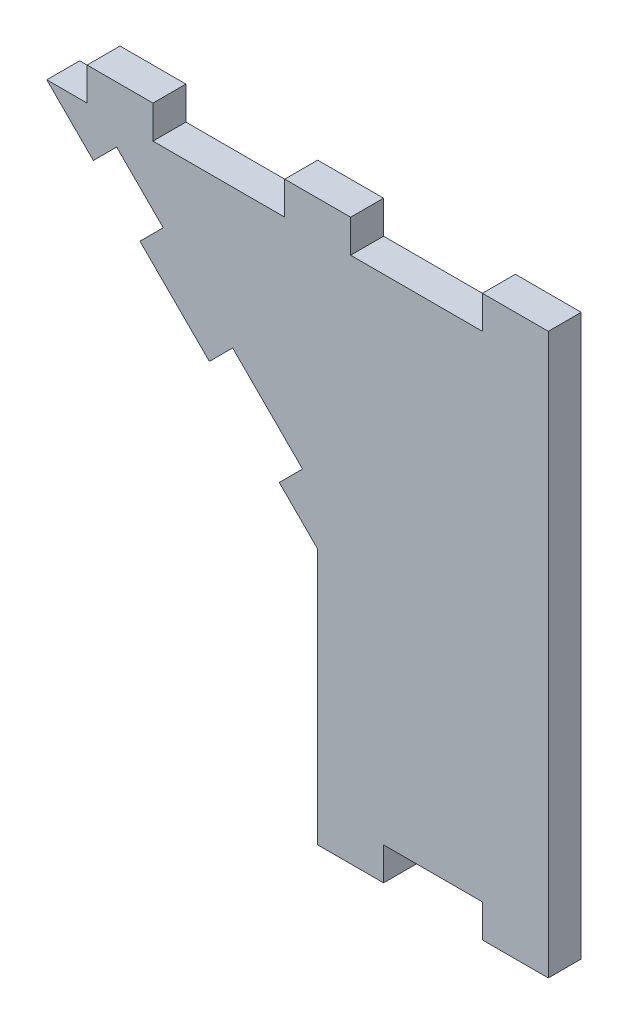
ISO-10303-21;
HEADER;
FILE_DESCRIPTION(('STEP AP214'),'2;1');
FILE_NAME('part.step','',(''),(''),'','','');
FILE_SCHEMA(('AUTOMOTIVE_DESIGN { 1 0 10303 214 1 1 1 1 }'));
ENDSEC;
DATA;
#1=APPLICATION_CONTEXT('core data for automotive mechanical design processes');
#2=APPLICATION_PROTOCOL_DEFINITION('international standard','automotive_design',2000,#1);
#3=PRODUCT_CONTEXT('',#1,'mechanical');
#4=PRODUCT('Part','Part','',(#3));
#5=PRODUCT_RELATED_PRODUCT_CATEGORY('part','',(#4));
#6=PRODUCT_DEFINITION_FORMATION('','',#4);
#7=PRODUCT_DEFINITION_CONTEXT('part definition',#1,'design');
#8=PRODUCT_DEFINITION('design','',#6,#7);
#9=PRODUCT_DEFINITION_SHAPE('','',#8);
#10=(LENGTH_UNIT() NAMED_UNIT(*) SI_UNIT(.MILLI.,.METRE.));
#11=(NAMED_UNIT(*) PLANE_ANGLE_UNIT() SI_UNIT($,.RADIAN.));
#12=(NAMED_UNIT(*) SI_UNIT($,.STERADIAN.) SOLID_ANGLE_UNIT());
#13=UNCERTAINTY_MEASURE_WITH_UNIT(LENGTH_MEASURE(1.E-05),#10,'distance_accuracy_value','');
#14=(GEOMETRIC_REPRESENTATION_CONTEXT(3) GLOBAL_UNCERTAINTY_ASSIGNED_CONTEXT((#13)) GLOBAL_UNIT_ASSIGNED_CONTEXT((#10,
#11,#12)) REPRESENTATION_CONTEXT('',''));
#15=CARTESIAN_POINT('',(0.,0.,0.));
#16=DIRECTION('',(0.,0.,1.));
#17=DIRECTION('',(1.,0.,0.));
#18=AXIS2_PLACEMENT_3D('',#15,#16,#17);
#19=CARTESIAN_POINT('',(0.,75.,5.));
#20=DIRECTION('',(-1.,0.,0.));
#21=DIRECTION('',(0.,0.,1.));
#22=AXIS2_PLACEMENT_3D('',#19,#20,#21);
#23=PLANE('',#22);
#24=DIRECTION('',(0.,1.,0.));
#25=VECTOR('',#24,1.);
#26=CARTESIAN_POINT('',(0.,75.,0.));
#27=LINE('',#26,#25);
#28=CARTESIAN_POINT('',(0.,-5.,0.));
#29=VERTEX_POINT('',#28);
#30=CARTESIAN_POINT('',(0.,80.,0.));
#31=VERTEX_POINT('',#30);
#32=EDGE_CURVE('E142',#29,#31,#27,.T.);
#33=ORIENTED_EDGE('',*,*,#32,.T.);
#34=DIRECTION('',(0.,0.,-1.));
#35=VECTOR('',#34,1.);
#36=CARTESIAN_POINT('',(0.,80.,5.));
#37=LINE('',#36,#35);
#38=CARTESIAN_POINT('',(0.,80.,5.));
#39=VERTEX_POINT('',#38);
#40=EDGE_CURVE('E11',#39,#31,#37,.T.);
#41=ORIENTED_EDGE('',*,*,#40,.F.);
#42=DIRECTION('',(0.,1.,0.));
#43=VECTOR('',#42,1.);
#44=CARTESIAN_POINT('',(0.,0.,5.));
#45=LINE('',#44,#43);
#46=CARTESIAN_POINT('',(0.,-5.,5.));
#47=VERTEX_POINT('',#46);
#48=EDGE_CURVE('E148',#47,#39,#45,.T.);
#49=ORIENTED_EDGE('',*,*,#48,.F.);
#50=DIRECTION('',(0.,0.,-1.));
#51=VECTOR('',#50,1.);
#52=CARTESIAN_POINT('',(0.,-5.,5.));
#53=LINE('',#52,#51);
#54=EDGE_CURVE('E239',#47,#29,#53,.T.);
#55=ORIENTED_EDGE('',*,*,#54,.T.);
#56=EDGE_LOOP('',(#33,#41,#49,#55));
#57=FACE_BOUND('',#56,.T.);
#58=ADVANCED_FACE('F33',(#57),#23,.F.);
#59=CARTESIAN_POINT('',(0.,80.,5.));
#60=DIRECTION('',(0.,-1.,0.));
#61=DIRECTION('',(0.,0.,-1.));
#62=AXIS2_PLACEMENT_3D('',#59,#60,#61);
#63=PLANE('',#62);
#64=DIRECTION('',(-1.,0.,0.));
#65=VECTOR('',#64,1.);
#66=CARTESIAN_POINT('',(0.,80.,0.));
#67=LINE('',#66,#65);
#68=CARTESIAN_POINT('',(-10.,80.,0.));
#69=VERTEX_POINT('',#68);
#70=EDGE_CURVE('E244',#31,#69,#67,.T.);
#71=ORIENTED_EDGE('',*,*,#70,.T.);
#72=DIRECTION('',(0.,0.,-1.));
#73=VECTOR('',#72,1.);
#74=CARTESIAN_POINT('',(-10.,80.,5.));
#75=LINE('',#74,#73);
#76=CARTESIAN_POINT('',(-10.,80.,5.));
#77=VERTEX_POINT('',#76);
#78=EDGE_CURVE('E41',#77,#69,#75,.T.);
#79=ORIENTED_EDGE('',*,*,#78,.F.);
#80=DIRECTION('',(-1.,0.,0.));
#81=VECTOR('',#80,1.);
#82=CARTESIAN_POINT('',(0.,80.,5.));
#83=LINE('',#82,#81);
#84=EDGE_CURVE('E438',#39,#77,#83,.T.);
#85=ORIENTED_EDGE('',*,*,#84,.F.);
#86=ORIENTED_EDGE('',*,*,#40,.T.);
#87=EDGE_LOOP('',(#71,#79,#85,#86));
#88=FACE_BOUND('',#87,.T.);
#89=ADVANCED_FACE('F441',(#88),#63,.F.);
#90=CARTESIAN_POINT('',(-10.,75.,5.));
#91=DIRECTION('',(1.,0.,0.));
#92=DIRECTION('',(0.,0.,-1.));
#93=AXIS2_PLACEMENT_3D('',#90,#91,#92);
#94=PLANE('',#93);
#95=DIRECTION('',(0.,-1.,0.));
#96=VECTOR('',#95,1.);
#97=CARTESIAN_POINT('',(-10.,75.,0.));
#98=LINE('',#97,#96);
#99=CARTESIAN_POINT('',(-10.,75.,0.));
#100=VERTEX_POINT('',#99);
#101=EDGE_CURVE('E246',#69,#100,#98,.T.);
#102=ORIENTED_EDGE('',*,*,#101,.T.);
#103=DIRECTION('',(0.,0.,-1.));
#104=VECTOR('',#103,1.);
#105=CARTESIAN_POINT('',(-10.,75.,5.));
#106=LINE('',#105,#104);
#107=CARTESIAN_POINT('',(-10.,75.,5.));
#108=VERTEX_POINT('',#107);
#109=EDGE_CURVE('E359',#108,#100,#106,.T.);
#110=ORIENTED_EDGE('',*,*,#109,.F.);
#111=DIRECTION('',(0.,-1.,0.));
#112=VECTOR('',#111,1.);
#113=CARTESIAN_POINT('',(-10.,75.,5.));
#114=LINE('',#113,#112);
#115=EDGE_CURVE('E368',#77,#108,#114,.T.);
#116=ORIENTED_EDGE('',*,*,#115,.F.);
#117=ORIENTED_EDGE('',*,*,#78,.T.);
#118=EDGE_LOOP('',(#102,#110,#116,#117));
#119=FACE_BOUND('',#118,.T.);
#120=ADVANCED_FACE('F366',(#119),#94,.F.);
#121=CARTESIAN_POINT('',(-30.,75.,5.));
#122=DIRECTION('',(0.,-1.,0.));
#123=DIRECTION('',(1.,0.,0.));
#124=AXIS2_PLACEMENT_3D('',#121,#122,#123);
#125=PLANE('',#124);
#126=DIRECTION('',(-1.,0.,0.));
#127=VECTOR('',#126,1.);
#128=CARTESIAN_POINT('',(-30.,75.,0.));
#129=LINE('',#128,#127);
#130=CARTESIAN_POINT('',(-30.,75.,0.));
#131=VERTEX_POINT('',#130);
#132=EDGE_CURVE('E248',#100,#131,#129,.T.);
#133=ORIENTED_EDGE('',*,*,#132,.T.);
#134=DIRECTION('',(0.,0.,-1.));
#135=VECTOR('',#134,1.);
#136=CARTESIAN_POINT('',(-30.,75.,5.));
#137=LINE('',#136,#135);
#138=CARTESIAN_POINT('',(-30.,75.,5.));
#139=VERTEX_POINT('',#138);
#140=EDGE_CURVE('E356',#139,#131,#137,.T.);
#141=ORIENTED_EDGE('',*,*,#140,.F.);
#142=DIRECTION('',(-1.,0.,0.));
#143=VECTOR('',#142,1.);
#144=CARTESIAN_POINT('',(-30.,75.,5.));
#145=LINE('',#144,#143);
#146=EDGE_CURVE('E386',#108,#139,#145,.T.);
#147=ORIENTED_EDGE('',*,*,#146,.F.);
#148=ORIENTED_EDGE('',*,*,#109,.T.);
#149=EDGE_LOOP('',(#133,#141,#147,#148));
#150=FACE_BOUND('',#149,.T.);
#151=ADVANCED_FACE('F377',(#150),#125,.F.);
#152=CARTESIAN_POINT('',(-30.,75.,5.));
#153=DIRECTION('',(-1.,0.,0.));
#154=DIRECTION('',(0.,0.,1.));
#155=AXIS2_PLACEMENT_3D('',#152,#153,#154);
#156=PLANE('',#155);
#157=DIRECTION('',(0.,1.,0.));
#158=VECTOR('',#157,1.);
#159=CARTESIAN_POINT('',(-30.,75.,0.));
#160=LINE('',#159,#158);
#161=CARTESIAN_POINT('',(-30.,80.,0.));
#162=VERTEX_POINT('',#161);
#163=EDGE_CURVE('E250',#131,#162,#160,.T.);
#164=ORIENTED_EDGE('',*,*,#163,.T.);
#165=DIRECTION('',(0.,0.,-1.));
#166=VECTOR('',#165,1.);
#167=CARTESIAN_POINT('',(-30.,80.,5.));
#168=LINE('',#167,#166);
#169=CARTESIAN_POINT('',(-30.,80.,5.));
#170=VERTEX_POINT('',#169);
#171=EDGE_CURVE('E353',#170,#162,#168,.T.);
#172=ORIENTED_EDGE('',*,*,#171,.F.);
#173=DIRECTION('',(0.,1.,0.));
#174=VECTOR('',#173,1.);
#175=CARTESIAN_POINT('',(-30.,75.,5.));
#176=LINE('',#175,#174);
#177=EDGE_CURVE('E383',#139,#170,#176,.T.);
#178=ORIENTED_EDGE('',*,*,#177,.F.);
#179=ORIENTED_EDGE('',*,*,#140,.T.);
#180=EDGE_LOOP('',(#164,#172,#178,#179));
#181=FACE_BOUND('',#180,.T.);
#182=ADVANCED_FACE('F381',(#181),#156,.F.);
#183=CARTESIAN_POINT('',(-40.,80.,5.));
#184=DIRECTION('',(0.,-1.,0.));
#185=DIRECTION('',(1.,0.,0.));
#186=AXIS2_PLACEMENT_3D('',#183,#184,#185);
#187=PLANE('',#186);
#188=DIRECTION('',(-1.,0.,0.));
#189=VECTOR('',#188,1.);
#190=CARTESIAN_POINT('',(-40.,80.,0.));
#191=LINE('',#190,#189);
#192=CARTESIAN_POINT('',(-40.,80.,0.));
#193=VERTEX_POINT('',#192);
#194=EDGE_CURVE('E252',#162,#193,#191,.T.);
#195=ORIENTED_EDGE('',*,*,#194,.T.);
#196=DIRECTION('',(0.,0.,-1.));
#197=VECTOR('',#196,1.);
#198=CARTESIAN_POINT('',(-40.,80.,5.));
#199=LINE('',#198,#197);
#200=CARTESIAN_POINT('',(-40.,80.,5.));
#201=VERTEX_POINT('',#200);
#202=EDGE_CURVE('E350',#201,#193,#199,.T.);
#203=ORIENTED_EDGE('',*,*,#202,.F.);
#204=DIRECTION('',(-1.,0.,0.));
#205=VECTOR('',#204,1.);
#206=CARTESIAN_POINT('',(-40.,80.,5.));
#207=LINE('',#206,#205);
#208=EDGE_CURVE('E385',#170,#201,#207,.T.);
#209=ORIENTED_EDGE('',*,*,#208,.F.);
#210=ORIENTED_EDGE('',*,*,#171,.T.);
#211=EDGE_LOOP('',(#195,#203,#209,#210));
#212=FACE_BOUND('',#211,.T.);
#213=ADVANCED_FACE('F453',(#212),#187,.F.);
#214=CARTESIAN_POINT('',(-40.,75.,5.));
#215=DIRECTION('',(1.,0.,0.));
#216=DIRECTION('',(0.,0.,-1.));
#217=AXIS2_PLACEMENT_3D('',#214,#215,#216);
#218=PLANE('',#217);
#219=DIRECTION('',(0.,-1.,0.));
#220=VECTOR('',#219,1.);
#221=CARTESIAN_POINT('',(-40.,75.,0.));
#222=LINE('',#221,#220);
#223=CARTESIAN_POINT('',(-40.,75.,0.));
#224=VERTEX_POINT('',#223);
#225=EDGE_CURVE('E254',#193,#224,#222,.T.);
#226=ORIENTED_EDGE('',*,*,#225,.T.);
#227=DIRECTION('',(0.,0.,-1.));
#228=VECTOR('',#227,1.);
#229=CARTESIAN_POINT('',(-40.,75.,5.));
#230=LINE('',#229,#228);
#231=CARTESIAN_POINT('',(-40.,75.,5.));
#232=VERTEX_POINT('',#231);
#233=EDGE_CURVE('E347',#232,#224,#230,.T.);
#234=ORIENTED_EDGE('',*,*,#233,.F.);
#235=DIRECTION('',(0.,-1.,0.));
#236=VECTOR('',#235,1.);
#237=CARTESIAN_POINT('',(-40.,75.,5.));
#238=LINE('',#237,#236);
#239=EDGE_CURVE('E388',#201,#232,#238,.T.);
#240=ORIENTED_EDGE('',*,*,#239,.F.);
#241=ORIENTED_EDGE('',*,*,#202,.T.);
#242=EDGE_LOOP('',(#226,#234,#240,#241));
#243=FACE_BOUND('',#242,.T.);
#244=ADVANCED_FACE('F456',(#243),#218,.F.);
#245=CARTESIAN_POINT('',(-60.,75.,5.));
#246=DIRECTION('',(0.,-1.,0.));
#247=DIRECTION('',(0.,0.,-1.));
#248=AXIS2_PLACEMENT_3D('',#245,#246,#247);
#249=PLANE('',#248);
#250=DIRECTION('',(-1.,0.,0.));
#251=VECTOR('',#250,1.);
#252=CARTESIAN_POINT('',(-60.,75.,0.));
#253=LINE('',#252,#251);
#254=CARTESIAN_POINT('',(-60.,75.,0.));
#255=VERTEX_POINT('',#254);
#256=EDGE_CURVE('E256',#224,#255,#253,.T.);
#257=ORIENTED_EDGE('',*,*,#256,.T.);
#258=DIRECTION('',(0.,0.,-1.));
#259=VECTOR('',#258,1.);
#260=CARTESIAN_POINT('',(-60.,75.,5.));
#261=LINE('',#260,#259);
#262=CARTESIAN_POINT('',(-60.,75.,5.));
#263=VERTEX_POINT('',#262);
#264=EDGE_CURVE('E344',#263,#255,#261,.T.);
#265=ORIENTED_EDGE('',*,*,#264,.F.);
#266=DIRECTION('',(-1.,0.,0.));
#267=VECTOR('',#266,1.);
#268=CARTESIAN_POINT('',(-60.,75.,5.));
#269=LINE('',#268,#267);
#270=EDGE_CURVE('E394',#232,#263,#269,.T.);
#271=ORIENTED_EDGE('',*,*,#270,.F.);
#272=ORIENTED_EDGE('',*,*,#233,.T.);
#273=EDGE_LOOP('',(#257,#265,#271,#272));
#274=FACE_BOUND('',#273,.T.);
#275=ADVANCED_FACE('F460',(#274),#249,.F.);
#276=CARTESIAN_POINT('',(-60.,75.,5.));
#277=DIRECTION('',(-1.,0.,0.));
#278=DIRECTION('',(0.,0.,1.));
#279=AXIS2_PLACEMENT_3D('',#276,#277,#278);
#280=PLANE('',#279);
#281=DIRECTION('',(0.,1.,0.));
#282=VECTOR('',#281,1.);
#283=CARTESIAN_POINT('',(-60.,75.,0.));
#284=LINE('',#283,#282);
#285=CARTESIAN_POINT('',(-60.,80.,0.));
#286=VERTEX_POINT('',#285);
#287=EDGE_CURVE('E258',#255,#286,#284,.T.);
#288=ORIENTED_EDGE('',*,*,#287,.T.);
#289=DIRECTION('',(0.,0.,-1.));
#290=VECTOR('',#289,1.);
#291=CARTESIAN_POINT('',(-60.,80.,5.));
#292=LINE('',#291,#290);
#293=CARTESIAN_POINT('',(-60.,80.,5.));
#294=VERTEX_POINT('',#293);
#295=EDGE_CURVE('E341',#294,#286,#292,.T.);
#296=ORIENTED_EDGE('',*,*,#295,.F.);
#297=DIRECTION('',(0.,1.,0.));
#298=VECTOR('',#297,1.);
#299=CARTESIAN_POINT('',(-60.,75.,5.));
#300=LINE('',#299,#298);
#301=EDGE_CURVE('E396',#263,#294,#300,.T.);
#302=ORIENTED_EDGE('',*,*,#301,.F.);
#303=ORIENTED_EDGE('',*,*,#264,.T.);
#304=EDGE_LOOP('',(#288,#296,#302,#303));
#305=FACE_BOUND('',#304,.T.);
#306=ADVANCED_FACE('F464',(#305),#280,.F.);
#307=CARTESIAN_POINT('',(-70.,80.,5.));
#308=DIRECTION('',(0.,-1.,0.));
#309=DIRECTION('',(1.,0.,0.));
#310=AXIS2_PLACEMENT_3D('',#307,#308,#309);
#311=PLANE('',#310);
#312=DIRECTION('',(-1.,0.,0.));
#313=VECTOR('',#312,1.);
#314=CARTESIAN_POINT('',(-70.,80.,0.));
#315=LINE('',#314,#313);
#316=CARTESIAN_POINT('',(-70.,80.,0.));
#317=VERTEX_POINT('',#316);
#318=EDGE_CURVE('E260',#286,#317,#315,.T.);
#319=ORIENTED_EDGE('',*,*,#318,.T.);
#320=DIRECTION('',(0.,0.,-1.));
#321=VECTOR('',#320,1.);
#322=CARTESIAN_POINT('',(-70.,80.,5.));
#323=LINE('',#322,#321);
#324=CARTESIAN_POINT('',(-70.,80.,5.));
#325=VERTEX_POINT('',#324);
#326=EDGE_CURVE('E338',#325,#317,#323,.T.);
#327=ORIENTED_EDGE('',*,*,#326,.F.);
#328=DIRECTION('',(-1.,0.,0.));
#329=VECTOR('',#328,1.);
#330=CARTESIAN_POINT('',(-70.,80.,5.));
#331=LINE('',#330,#329);
#332=EDGE_CURVE('E398',#294,#325,#331,.T.);
#333=ORIENTED_EDGE('',*,*,#332,.F.);
#334=ORIENTED_EDGE('',*,*,#295,.T.);
#335=EDGE_LOOP('',(#319,#327,#333,#334));
#336=FACE_BOUND('',#335,.T.);
#337=ADVANCED_FACE('F468',(#336),#311,.F.);
#338=CARTESIAN_POINT('',(-70.,75.,5.));
#339=DIRECTION('',(1.,0.,0.));
#340=DIRECTION('',(0.,0.,-1.));
#341=AXIS2_PLACEMENT_3D('',#338,#339,#340);
#342=PLANE('',#341);
#343=DIRECTION('',(0.,-1.,0.));
#344=VECTOR('',#343,1.);
#345=CARTESIAN_POINT('',(-70.,75.,0.));
#346=LINE('',#345,#344);
#347=CARTESIAN_POINT('',(-70.,75.,0.));
#348=VERTEX_POINT('',#347);
#349=EDGE_CURVE('E262',#317,#348,#346,.T.);
#350=ORIENTED_EDGE('',*,*,#349,.T.);
#351=DIRECTION('',(0.,0.,-1.));
#352=VECTOR('',#351,1.);
#353=CARTESIAN_POINT('',(-70.,75.,5.));
#354=LINE('',#353,#352);
#355=CARTESIAN_POINT('',(-70.,75.,5.));
#356=VERTEX_POINT('',#355);
#357=EDGE_CURVE('E335',#356,#348,#354,.T.);
#358=ORIENTED_EDGE('',*,*,#357,.F.);
#359=DIRECTION('',(0.,-1.,0.));
#360=VECTOR('',#359,1.);
#361=CARTESIAN_POINT('',(-70.,75.,5.));
#362=LINE('',#361,#360);
#363=EDGE_CURVE('E400',#325,#356,#362,.T.);
#364=ORIENTED_EDGE('',*,*,#363,.F.);
#365=ORIENTED_EDGE('',*,*,#326,.T.);
#366=EDGE_LOOP('',(#350,#358,#364,#365));
#367=FACE_BOUND('',#366,.T.);
#368=ADVANCED_FACE('F472',(#367),#342,.F.);
#369=CARTESIAN_POINT('',(-76.1182593259979,75.,5.));
#370=DIRECTION('',(0.,-1.,0.));
#371=DIRECTION('',(0.,0.,-1.));
#372=AXIS2_PLACEMENT_3D('',#369,#370,#371);
#373=PLANE('',#372);
#374=DIRECTION('',(-1.,0.,0.));
#375=VECTOR('',#374,1.);
#376=CARTESIAN_POINT('',(-76.1182593259979,75.,0.));
#377=LINE('',#376,#375);
#378=CARTESIAN_POINT('',(-76.1182593259979,75.,0.));
#379=VERTEX_POINT('',#378);
#380=EDGE_CURVE('E264',#348,#379,#377,.T.);
#381=ORIENTED_EDGE('',*,*,#380,.T.);
#382=DIRECTION('',(0.,0.,-1.));
#383=VECTOR('',#382,1.);
#384=CARTESIAN_POINT('',(-76.1182593259979,75.,5.));
#385=LINE('',#384,#383);
#386=CARTESIAN_POINT('',(-76.1182593259979,75.,5.));
#387=VERTEX_POINT('',#386);
#388=EDGE_CURVE('E332',#387,#379,#385,.T.);
#389=ORIENTED_EDGE('',*,*,#388,.F.);
#390=DIRECTION('',(-1.,0.,0.));
#391=VECTOR('',#390,1.);
#392=CARTESIAN_POINT('',(-76.1182593259979,75.,5.));
#393=LINE('',#392,#391);
#394=EDGE_CURVE('E402',#356,#387,#393,.T.);
#395=ORIENTED_EDGE('',*,*,#394,.F.);
#396=ORIENTED_EDGE('',*,*,#357,.T.);
#397=EDGE_LOOP('',(#381,#389,#395,#396));
#398=FACE_BOUND('',#397,.T.);
#399=ADVANCED_FACE('F476',(#398),#373,.F.);
#400=CARTESIAN_POINT('',(-69.0471915141324,67.9289321881346,5.));
#401=DIRECTION('',(0.707106781186544,0.707106781186551,0.));
#402=DIRECTION('',(-0.707106781186551,0.707106781186544,0.));
#403=AXIS2_PLACEMENT_3D('',#400,#401,#402);
#404=PLANE('',#403);
#405=DIRECTION('',(0.707106781186551,-0.707106781186544,0.));
#406=VECTOR('',#405,1.);
#407=CARTESIAN_POINT('',(-69.0471915141324,67.9289321881346,0.));
#408=LINE('',#407,#406);
#409=CARTESIAN_POINT('',(-69.0471915141324,67.9289321881346,0.));
#410=VERTEX_POINT('',#409);
#411=EDGE_CURVE('E266',#379,#410,#408,.T.);
#412=ORIENTED_EDGE('',*,*,#411,.T.);
#413=DIRECTION('',(0.,0.,-1.));
#414=VECTOR('',#413,1.);
#415=CARTESIAN_POINT('',(-69.0471915141324,67.9289321881346,5.));
#416=LINE('',#415,#414);
#417=CARTESIAN_POINT('',(-69.0471915141324,67.9289321881346,5.));
#418=VERTEX_POINT('',#417);
#419=EDGE_CURVE('E329',#418,#410,#416,.T.);
#420=ORIENTED_EDGE('',*,*,#419,.F.);
#421=DIRECTION('',(0.707106781186551,-0.707106781186544,0.));
#422=VECTOR('',#421,1.);
#423=CARTESIAN_POINT('',(-69.0471915141324,67.9289321881346,5.));
#424=LINE('',#423,#422);
#425=EDGE_CURVE('E404',#387,#418,#424,.T.);
#426=ORIENTED_EDGE('',*,*,#425,.F.);
#427=ORIENTED_EDGE('',*,*,#388,.T.);
#428=EDGE_LOOP('',(#412,#420,#426,#427));
#429=FACE_BOUND('',#428,.T.);
#430=ADVANCED_FACE('F480',(#429),#404,.F.);
#431=CARTESIAN_POINT('',(-69.0471915141324,67.9289321881346,5.));
#432=DIRECTION('',(-0.707106781186553,0.707106781186542,0.));
#433=DIRECTION('',(-0.707106781186542,-0.707106781186553,0.));
#434=AXIS2_PLACEMENT_3D('',#431,#432,#433);
#435=PLANE('',#434);
#436=DIRECTION('',(0.707106781186542,0.707106781186553,0.));
#437=VECTOR('',#436,1.);
#438=CARTESIAN_POINT('',(-69.0471915141324,67.9289321881346,0.));
#439=LINE('',#438,#437);
#440=CARTESIAN_POINT('',(-65.5116576081997,71.4644660940673,0.));
#441=VERTEX_POINT('',#440);
#442=EDGE_CURVE('E268',#410,#441,#439,.T.);
#443=ORIENTED_EDGE('',*,*,#442,.T.);
#444=DIRECTION('',(0.,0.,-1.));
#445=VECTOR('',#444,1.);
#446=CARTESIAN_POINT('',(-65.5116576081997,71.4644660940673,5.));
#447=LINE('',#446,#445);
#448=CARTESIAN_POINT('',(-65.5116576081997,71.4644660940673,5.));
#449=VERTEX_POINT('',#448);
#450=EDGE_CURVE('E326',#449,#441,#447,.T.);
#451=ORIENTED_EDGE('',*,*,#450,.F.);
#452=DIRECTION('',(0.707106781186542,0.707106781186553,0.));
#453=VECTOR('',#452,1.);
#454=CARTESIAN_POINT('',(-69.0471915141324,67.9289321881346,5.));
#455=LINE('',#454,#453);
#456=EDGE_CURVE('E406',#418,#449,#455,.T.);
#457=ORIENTED_EDGE('',*,*,#456,.F.);
#458=ORIENTED_EDGE('',*,*,#419,.T.);
#459=EDGE_LOOP('',(#443,#451,#457,#458));
#460=FACE_BOUND('',#459,.T.);
#461=ADVANCED_FACE('F484',(#460),#435,.F.);
#462=CARTESIAN_POINT('',(-65.5116576081997,71.4644660940673,5.));
#463=DIRECTION('',(0.707106781186544,0.707106781186551,0.));
#464=DIRECTION('',(-0.707106781186551,0.707106781186544,0.));
#465=AXIS2_PLACEMENT_3D('',#462,#463,#464);
#466=PLANE('',#465);
#467=DIRECTION('',(0.707106781186551,-0.707106781186544,0.));
#468=VECTOR('',#467,1.);
#469=CARTESIAN_POINT('',(-65.5116576081997,71.4644660940673,0.));
#470=LINE('',#469,#468);
#471=CARTESIAN_POINT('',(-58.4405897963342,64.3933982822019,0.));
#472=VERTEX_POINT('',#471);
#473=EDGE_CURVE('E270',#441,#472,#470,.T.);
#474=ORIENTED_EDGE('',*,*,#473,.T.);
#475=DIRECTION('',(0.,0.,-1.));
#476=VECTOR('',#475,1.);
#477=CARTESIAN_POINT('',(-58.4405897963342,64.3933982822019,5.));
#478=LINE('',#477,#476);
#479=CARTESIAN_POINT('',(-58.4405897963342,64.3933982822019,5.));
#480=VERTEX_POINT('',#479);
#481=EDGE_CURVE('E323',#480,#472,#478,.T.);
#482=ORIENTED_EDGE('',*,*,#481,.F.);
#483=DIRECTION('',(0.707106781186551,-0.707106781186544,0.));
#484=VECTOR('',#483,1.);
#485=CARTESIAN_POINT('',(-65.5116576081997,71.4644660940673,5.));
#486=LINE('',#485,#484);
#487=EDGE_CURVE('E408',#449,#480,#486,.T.);
#488=ORIENTED_EDGE('',*,*,#487,.F.);
#489=ORIENTED_EDGE('',*,*,#450,.T.);
#490=EDGE_LOOP('',(#474,#482,#488,#489));
#491=FACE_BOUND('',#490,.T.);
#492=ADVANCED_FACE('F488',(#491),#466,.F.);
#493=CARTESIAN_POINT('',(-61.9761237022669,60.8578643762691,5.));
#494=DIRECTION('',(0.707106781186551,-0.707106781186544,0.));
#495=DIRECTION('',(0.707106781186544,0.707106781186551,0.));
#496=AXIS2_PLACEMENT_3D('',#493,#494,#495);
#497=PLANE('',#496);
#498=DIRECTION('',(-0.707106781186544,-0.707106781186551,0.));
#499=VECTOR('',#498,1.);
#500=CARTESIAN_POINT('',(-61.9761237022669,60.8578643762691,0.));
#501=LINE('',#500,#499);
#502=CARTESIAN_POINT('',(-61.9761237022669,60.8578643762691,0.));
#503=VERTEX_POINT('',#502);
#504=EDGE_CURVE('E272',#472,#503,#501,.T.);
#505=ORIENTED_EDGE('',*,*,#504,.T.);
#506=DIRECTION('',(0.,0.,-1.));
#507=VECTOR('',#506,1.);
#508=CARTESIAN_POINT('',(-61.9761237022669,60.8578643762691,5.));
#509=LINE('',#508,#507);
#510=CARTESIAN_POINT('',(-61.9761237022669,60.8578643762691,5.));
#511=VERTEX_POINT('',#510);
#512=EDGE_CURVE('E320',#511,#503,#509,.T.);
#513=ORIENTED_EDGE('',*,*,#512,.F.);
#514=DIRECTION('',(-0.707106781186544,-0.707106781186551,0.));
#515=VECTOR('',#514,1.);
#516=CARTESIAN_POINT('',(-61.9761237022669,60.8578643762691,5.));
#517=LINE('',#516,#515);
#518=EDGE_CURVE('E410',#480,#511,#517,.T.);
#519=ORIENTED_EDGE('',*,*,#518,.F.);
#520=ORIENTED_EDGE('',*,*,#481,.T.);
#521=EDGE_LOOP('',(#505,#513,#519,#520));
#522=FACE_BOUND('',#521,.T.);
#523=ADVANCED_FACE('F492',(#522),#497,.F.);
#524=CARTESIAN_POINT('',(-51.4402326625873,50.3219733365896,5.));
#525=DIRECTION('',(0.707106781186545,0.70710678118655,0.));
#526=DIRECTION('',(-0.70710678118655,0.707106781186545,0.));
#527=AXIS2_PLACEMENT_3D('',#524,#525,#526);
#528=PLANE('',#527);
#529=DIRECTION('',(0.70710678118655,-0.707106781186545,0.));
#530=VECTOR('',#529,1.);
#531=CARTESIAN_POINT('',(-51.4402326625873,50.3219733365896,0.));
#532=LINE('',#531,#530);
#533=CARTESIAN_POINT('',(-51.4402326625873,50.3219733365896,0.));
#534=VERTEX_POINT('',#533);
#535=EDGE_CURVE('E274',#503,#534,#532,.T.);
#536=ORIENTED_EDGE('',*,*,#535,.T.);
#537=DIRECTION('',(0.,0.,-1.));
#538=VECTOR('',#537,1.);
#539=CARTESIAN_POINT('',(-51.4402326625873,50.3219733365896,5.));
#540=LINE('',#539,#538);
#541=CARTESIAN_POINT('',(-51.4402326625873,50.3219733365896,5.));
#542=VERTEX_POINT('',#541);
#543=EDGE_CURVE('E317',#542,#534,#540,.T.);
#544=ORIENTED_EDGE('',*,*,#543,.F.);
#545=DIRECTION('',(0.70710678118655,-0.707106781186545,0.));
#546=VECTOR('',#545,1.);
#547=CARTESIAN_POINT('',(-51.4402326625873,50.3219733365896,5.));
#548=LINE('',#547,#546);
#549=EDGE_CURVE('E412',#511,#542,#548,.T.);
#550=ORIENTED_EDGE('',*,*,#549,.F.);
#551=ORIENTED_EDGE('',*,*,#512,.T.);
#552=EDGE_LOOP('',(#536,#544,#550,#551));
#553=FACE_BOUND('',#552,.T.);
#554=ADVANCED_FACE('F496',(#553),#528,.F.);
#555=CARTESIAN_POINT('',(-51.4402326625873,50.3219733365896,5.));
#556=DIRECTION('',(-0.707106781186552,0.707106781186543,0.));
#557=DIRECTION('',(-0.707106781186543,-0.707106781186552,0.));
#558=AXIS2_PLACEMENT_3D('',#555,#556,#557);
#559=PLANE('',#558);
#560=DIRECTION('',(0.707106781186543,0.707106781186552,0.));
#561=VECTOR('',#560,1.);
#562=CARTESIAN_POINT('',(-51.4402326625873,50.3219733365896,0.));
#563=LINE('',#562,#561);
#564=CARTESIAN_POINT('',(-47.9046987566546,53.8575072425224,0.));
#565=VERTEX_POINT('',#564);
#566=EDGE_CURVE('E276',#534,#565,#563,.T.);
#567=ORIENTED_EDGE('',*,*,#566,.T.);
#568=DIRECTION('',(0.,0.,-1.));
#569=VECTOR('',#568,1.);
#570=CARTESIAN_POINT('',(-47.9046987566546,53.8575072425224,5.));
#571=LINE('',#570,#569);
#572=CARTESIAN_POINT('',(-47.9046987566546,53.8575072425224,5.));
#573=VERTEX_POINT('',#572);
#574=EDGE_CURVE('E314',#573,#565,#571,.T.);
#575=ORIENTED_EDGE('',*,*,#574,.F.);
#576=DIRECTION('',(0.707106781186543,0.707106781186552,0.));
#577=VECTOR('',#576,1.);
#578=CARTESIAN_POINT('',(-51.4402326625873,50.3219733365896,5.));
#579=LINE('',#578,#577);
#580=EDGE_CURVE('E414',#542,#573,#579,.T.);
#581=ORIENTED_EDGE('',*,*,#580,.F.);
#582=ORIENTED_EDGE('',*,*,#543,.T.);
#583=EDGE_LOOP('',(#567,#575,#581,#582));
#584=FACE_BOUND('',#583,.T.);
#585=ADVANCED_FACE('F500',(#584),#559,.F.);
#586=CARTESIAN_POINT('',(-47.9046987566546,53.8575072425224,5.));
#587=DIRECTION('',(0.707106781186544,0.707106781186551,0.));
#588=DIRECTION('',(-0.707106781186551,0.707106781186544,0.));
#589=AXIS2_PLACEMENT_3D('',#586,#587,#588);
#590=PLANE('',#589);
#591=DIRECTION('',(0.707106781186551,-0.707106781186544,0.));
#592=VECTOR('',#591,1.);
#593=CARTESIAN_POINT('',(-47.9046987566546,53.8575072425224,0.));
#594=LINE('',#593,#592);
#595=CARTESIAN_POINT('',(-37.2980970388563,43.2509055247242,0.));
#596=VERTEX_POINT('',#595);
#597=EDGE_CURVE('E278',#565,#596,#594,.T.);
#598=ORIENTED_EDGE('',*,*,#597,.T.);
#599=DIRECTION('',(0.,0.,-1.));
#600=VECTOR('',#599,1.);
#601=CARTESIAN_POINT('',(-37.2980970388563,43.2509055247242,5.));
#602=LINE('',#601,#600);
#603=CARTESIAN_POINT('',(-37.2980970388563,43.2509055247242,5.));
#604=VERTEX_POINT('',#603);
#605=EDGE_CURVE('E311',#604,#596,#602,.T.);
#606=ORIENTED_EDGE('',*,*,#605,.F.);
#607=DIRECTION('',(0.707106781186551,-0.707106781186544,0.));
#608=VECTOR('',#607,1.);
#609=CARTESIAN_POINT('',(-47.9046987566546,53.8575072425224,5.));
#610=LINE('',#609,#608);
#611=EDGE_CURVE('E416',#573,#604,#610,.T.);
#612=ORIENTED_EDGE('',*,*,#611,.F.);
#613=ORIENTED_EDGE('',*,*,#574,.T.);
#614=EDGE_LOOP('',(#598,#606,#612,#613));
#615=FACE_BOUND('',#614,.T.);
#616=ADVANCED_FACE('F504',(#615),#590,.F.);
#617=CARTESIAN_POINT('',(-40.833630944789,39.7153716187915,5.));
#618=DIRECTION('',(0.707106781186552,-0.707106781186543,0.));
#619=DIRECTION('',(0.707106781186543,0.707106781186552,0.));
#620=AXIS2_PLACEMENT_3D('',#617,#618,#619);
#621=PLANE('',#620);
#622=DIRECTION('',(-0.707106781186543,-0.707106781186552,0.));
#623=VECTOR('',#622,1.);
#624=CARTESIAN_POINT('',(-40.833630944789,39.7153716187915,0.));
#625=LINE('',#624,#623);
#626=CARTESIAN_POINT('',(-40.833630944789,39.7153716187915,0.));
#627=VERTEX_POINT('',#626);
#628=EDGE_CURVE('E280',#596,#627,#625,.T.);
#629=ORIENTED_EDGE('',*,*,#628,.T.);
#630=DIRECTION('',(0.,0.,-1.));
#631=VECTOR('',#630,1.);
#632=CARTESIAN_POINT('',(-40.833630944789,39.7153716187915,5.));
#633=LINE('',#632,#631);
#634=CARTESIAN_POINT('',(-40.833630944789,39.7153716187915,5.));
#635=VERTEX_POINT('',#634);
#636=EDGE_CURVE('E308',#635,#627,#633,.T.);
#637=ORIENTED_EDGE('',*,*,#636,.F.);
#638=DIRECTION('',(-0.707106781186543,-0.707106781186552,0.));
#639=VECTOR('',#638,1.);
#640=CARTESIAN_POINT('',(-40.833630944789,39.7153716187915,5.));
#641=LINE('',#640,#639);
#642=EDGE_CURVE('E418',#604,#635,#641,.T.);
#643=ORIENTED_EDGE('',*,*,#642,.F.);
#644=ORIENTED_EDGE('',*,*,#605,.T.);
#645=EDGE_LOOP('',(#629,#637,#643,#644));
#646=FACE_BOUND('',#645,.T.);
#647=ADVANCED_FACE('F508',(#646),#621,.F.);
#648=CARTESIAN_POINT('',(-35.,33.8817406740025,5.));
#649=DIRECTION('',(0.707106781186543,0.707106781186552,0.));
#650=DIRECTION('',(-0.707106781186552,0.707106781186543,0.));
#651=AXIS2_PLACEMENT_3D('',#648,#649,#650);
#652=PLANE('',#651);
#653=DIRECTION('',(0.707106781186552,-0.707106781186543,0.));
#654=VECTOR('',#653,1.);
#655=CARTESIAN_POINT('',(-35.,33.8817406740025,0.));
#656=LINE('',#655,#654);
#657=CARTESIAN_POINT('',(-35.,33.8817406740025,0.));
#658=VERTEX_POINT('',#657);
#659=EDGE_CURVE('E282',#627,#658,#656,.T.);
#660=ORIENTED_EDGE('',*,*,#659,.T.);
#661=DIRECTION('',(0.,0.,-1.));
#662=VECTOR('',#661,1.);
#663=CARTESIAN_POINT('',(-35.,33.8817406740025,5.));
#664=LINE('',#663,#662);
#665=CARTESIAN_POINT('',(-35.,33.8817406740025,5.));
#666=VERTEX_POINT('',#665);
#667=EDGE_CURVE('E305',#666,#658,#664,.T.);
#668=ORIENTED_EDGE('',*,*,#667,.F.);
#669=DIRECTION('',(0.707106781186552,-0.707106781186543,0.));
#670=VECTOR('',#669,1.);
#671=CARTESIAN_POINT('',(-35.,33.8817406740025,5.));
#672=LINE('',#671,#670);
#673=EDGE_CURVE('E420',#635,#666,#672,.T.);
#674=ORIENTED_EDGE('',*,*,#673,.F.);
#675=ORIENTED_EDGE('',*,*,#636,.T.);
#676=EDGE_LOOP('',(#660,#668,#674,#675));
#677=FACE_BOUND('',#676,.T.);
#678=ADVANCED_FACE('F512',(#677),#652,.F.);
#679=CARTESIAN_POINT('',(-35.,0.,5.));
#680=DIRECTION('',(1.,0.,0.));
#681=DIRECTION('',(0.,0.,-1.));
#682=AXIS2_PLACEMENT_3D('',#679,#680,#681);
#683=PLANE('',#682);
#684=DIRECTION('',(0.,-1.,0.));
#685=VECTOR('',#684,1.);
#686=CARTESIAN_POINT('',(-35.,0.,0.));
#687=LINE('',#686,#685);
#688=CARTESIAN_POINT('',(-35.,-5.,0.));
#689=VERTEX_POINT('',#688);
#690=EDGE_CURVE('E285',#658,#689,#687,.T.);
#691=ORIENTED_EDGE('',*,*,#690,.T.);
#692=DIRECTION('',(0.,0.,-1.));
#693=VECTOR('',#692,1.);
#694=CARTESIAN_POINT('',(-35.,-5.,5.));
#695=LINE('',#694,#693);
#696=CARTESIAN_POINT('',(-35.,-5.,5.));
#697=VERTEX_POINT('',#696);
#698=EDGE_CURVE('E302',#697,#689,#695,.T.);
#699=ORIENTED_EDGE('',*,*,#698,.F.);
#700=DIRECTION('',(0.,-1.,0.));
#701=VECTOR('',#700,1.);
#702=CARTESIAN_POINT('',(-35.,0.,5.));
#703=LINE('',#702,#701);
#704=EDGE_CURVE('E422',#666,#697,#703,.T.);
#705=ORIENTED_EDGE('',*,*,#704,.F.);
#706=ORIENTED_EDGE('',*,*,#667,.T.);
#707=EDGE_LOOP('',(#691,#699,#705,#706));
#708=FACE_BOUND('',#707,.T.);
#709=ADVANCED_FACE('F516',(#708),#683,.F.);
#710=CARTESIAN_POINT('',(-35.,-5.,5.));
#711=DIRECTION('',(0.,1.,0.));
#712=DIRECTION('',(0.,0.,1.));
#713=AXIS2_PLACEMENT_3D('',#710,#711,#712);
#714=PLANE('',#713);
#715=DIRECTION('',(1.,0.,0.));
#716=VECTOR('',#715,1.);
#717=CARTESIAN_POINT('',(-35.,-5.,0.));
#718=LINE('',#717,#716);
#719=CARTESIAN_POINT('',(-25.,-5.,0.));
#720=VERTEX_POINT('',#719);
#721=EDGE_CURVE('E287',#689,#720,#718,.T.);
#722=ORIENTED_EDGE('',*,*,#721,.T.);
#723=DIRECTION('',(0.,0.,-1.));
#724=VECTOR('',#723,1.);
#725=CARTESIAN_POINT('',(-25.,-5.,5.));
#726=LINE('',#725,#724);
#727=CARTESIAN_POINT('',(-25.,-5.,5.));
#728=VERTEX_POINT('',#727);
#729=EDGE_CURVE('E299',#728,#720,#726,.T.);
#730=ORIENTED_EDGE('',*,*,#729,.F.);
#731=DIRECTION('',(1.,0.,0.));
#732=VECTOR('',#731,1.);
#733=CARTESIAN_POINT('',(-35.,-5.,5.));
#734=LINE('',#733,#732);
#735=EDGE_CURVE('E424',#697,#728,#734,.T.);
#736=ORIENTED_EDGE('',*,*,#735,.F.);
#737=ORIENTED_EDGE('',*,*,#698,.T.);
#738=EDGE_LOOP('',(#722,#730,#736,#737));
#739=FACE_BOUND('',#738,.T.);
#740=ADVANCED_FACE('F430',(#739),#714,.F.);
#741=CARTESIAN_POINT('',(-25.,0.,5.));
#742=DIRECTION('',(-1.,0.,0.));
#743=DIRECTION('',(0.,0.,1.));
#744=AXIS2_PLACEMENT_3D('',#741,#742,#743);
#745=PLANE('',#744);
#746=DIRECTION('',(0.,1.,0.));
#747=VECTOR('',#746,1.);
#748=CARTESIAN_POINT('',(-25.,0.,0.));
#749=LINE('',#748,#747);
#750=CARTESIAN_POINT('',(-25.,0.,0.));
#751=VERTEX_POINT('',#750);
#752=EDGE_CURVE('E289',#720,#751,#749,.T.);
#753=ORIENTED_EDGE('',*,*,#752,.T.);
#754=DIRECTION('',(0.,0.,-1.));
#755=VECTOR('',#754,1.);
#756=CARTESIAN_POINT('',(-25.,0.,5.));
#757=LINE('',#756,#755);
#758=CARTESIAN_POINT('',(-25.,0.,5.));
#759=VERTEX_POINT('',#758);
#760=EDGE_CURVE('E234',#759,#751,#757,.T.);
#761=ORIENTED_EDGE('',*,*,#760,.F.);
#762=DIRECTION('',(0.,1.,0.));
#763=VECTOR('',#762,1.);
#764=CARTESIAN_POINT('',(-25.,0.,5.));
#765=LINE('',#764,#763);
#766=EDGE_CURVE('E225',#728,#759,#765,.T.);
#767=ORIENTED_EDGE('',*,*,#766,.F.);
#768=ORIENTED_EDGE('',*,*,#729,.T.);
#769=EDGE_LOOP('',(#753,#761,#767,#768));
#770=FACE_BOUND('',#769,.T.);
#771=ADVANCED_FACE('F434',(#770),#745,.F.);
#772=CARTESIAN_POINT('',(-10.,0.,5.));
#773=DIRECTION('',(0.,1.,0.));
#774=DIRECTION('',(-1.,0.,0.));
#775=AXIS2_PLACEMENT_3D('',#772,#773,#774);
#776=PLANE('',#775);
#777=DIRECTION('',(1.,0.,0.));
#778=VECTOR('',#777,1.);
#779=CARTESIAN_POINT('',(-10.,0.,0.));
#780=LINE('',#779,#778);
#781=CARTESIAN_POINT('',(-10.,0.,0.));
#782=VERTEX_POINT('',#781);
#783=EDGE_CURVE('E233',#751,#782,#780,.T.);
#784=ORIENTED_EDGE('',*,*,#783,.T.);
#785=DIRECTION('',(0.,0.,-1.));
#786=VECTOR('',#785,1.);
#787=CARTESIAN_POINT('',(-10.,0.,5.));
#788=LINE('',#787,#786);
#789=CARTESIAN_POINT('',(-10.,0.,5.));
#790=VERTEX_POINT('',#789);
#791=EDGE_CURVE('E230',#790,#782,#788,.T.);
#792=ORIENTED_EDGE('',*,*,#791,.F.);
#793=DIRECTION('',(1.,0.,0.));
#794=VECTOR('',#793,1.);
#795=CARTESIAN_POINT('',(-10.,0.,5.));
#796=LINE('',#795,#794);
#797=EDGE_CURVE('E219',#759,#790,#796,.T.);
#798=ORIENTED_EDGE('',*,*,#797,.F.);
#799=ORIENTED_EDGE('',*,*,#760,.T.);
#800=EDGE_LOOP('',(#784,#792,#798,#799));
#801=FACE_BOUND('',#800,.T.);
#802=ADVANCED_FACE('F231',(#801),#776,.F.);
#803=CARTESIAN_POINT('',(-10.,0.,5.));
#804=DIRECTION('',(1.,0.,0.));
#805=DIRECTION('',(0.,0.,-1.));
#806=AXIS2_PLACEMENT_3D('',#803,#804,#805);
#807=PLANE('',#806);
#808=DIRECTION('',(0.,-1.,0.));
#809=VECTOR('',#808,1.);
#810=CARTESIAN_POINT('',(-10.,0.,0.));
#811=LINE('',#810,#809);
#812=CARTESIAN_POINT('',(-10.,-5.,0.));
#813=VERTEX_POINT('',#812);
#814=EDGE_CURVE('E135',#782,#813,#811,.T.);
#815=ORIENTED_EDGE('',*,*,#814,.T.);
#816=DIRECTION('',(0.,0.,-1.));
#817=VECTOR('',#816,1.);
#818=CARTESIAN_POINT('',(-10.,-5.,5.));
#819=LINE('',#818,#817);
#820=CARTESIAN_POINT('',(-10.,-5.,5.));
#821=VERTEX_POINT('',#820);
#822=EDGE_CURVE('E235',#821,#813,#819,.T.);
#823=ORIENTED_EDGE('',*,*,#822,.F.);
#824=DIRECTION('',(0.,-1.,0.));
#825=VECTOR('',#824,1.);
#826=CARTESIAN_POINT('',(-10.,0.,5.));
#827=LINE('',#826,#825);
#828=EDGE_CURVE('E223',#790,#821,#827,.T.);
#829=ORIENTED_EDGE('',*,*,#828,.F.);
#830=ORIENTED_EDGE('',*,*,#791,.T.);
#831=EDGE_LOOP('',(#815,#823,#829,#830));
#832=FACE_BOUND('',#831,.T.);
#833=ADVANCED_FACE('F237',(#832),#807,.F.);
#834=CARTESIAN_POINT('',(0.,-5.,5.));
#835=DIRECTION('',(0.,1.,0.));
#836=DIRECTION('',(-1.,0.,0.));
#837=AXIS2_PLACEMENT_3D('',#834,#835,#836);
#838=PLANE('',#837);
#839=DIRECTION('',(1.,0.,0.));
#840=VECTOR('',#839,1.);
#841=CARTESIAN_POINT('',(0.,-5.,0.));
#842=LINE('',#841,#840);
#843=EDGE_CURVE('E293',#813,#29,#842,.T.);
#844=ORIENTED_EDGE('',*,*,#843,.T.);
#845=ORIENTED_EDGE('',*,*,#54,.F.);
#846=DIRECTION('',(1.,0.,0.));
#847=VECTOR('',#846,1.);
#848=CARTESIAN_POINT('',(0.,-5.,5.));
#849=LINE('',#848,#847);
#850=EDGE_CURVE('E49',#821,#47,#849,.T.);
#851=ORIENTED_EDGE('',*,*,#850,.F.);
#852=ORIENTED_EDGE('',*,*,#822,.T.);
#853=EDGE_LOOP('',(#844,#845,#851,#852));
#854=FACE_BOUND('',#853,.T.);
#855=ADVANCED_FACE('F436',(#854),#838,.F.);
#856=CARTESIAN_POINT('',(0.,0.,5.));
#857=DIRECTION('',(0.,0.,-1.));
#858=DIRECTION('',(-1.,0.,0.));
#859=AXIS2_PLACEMENT_3D('',#856,#857,#858);
#860=PLANE('',#859);
#861=ORIENTED_EDGE('',*,*,#48,.T.);
#862=ORIENTED_EDGE('',*,*,#84,.T.);
#863=ORIENTED_EDGE('',*,*,#115,.T.);
#864=ORIENTED_EDGE('',*,*,#146,.T.);
#865=ORIENTED_EDGE('',*,*,#177,.T.);
#866=ORIENTED_EDGE('',*,*,#208,.T.);
#867=ORIENTED_EDGE('',*,*,#239,.T.);
#868=ORIENTED_EDGE('',*,*,#270,.T.);
#869=ORIENTED_EDGE('',*,*,#301,.T.);
#870=ORIENTED_EDGE('',*,*,#332,.T.);
#871=ORIENTED_EDGE('',*,*,#363,.T.);
#872=ORIENTED_EDGE('',*,*,#394,.T.);
#873=ORIENTED_EDGE('',*,*,#425,.T.);
#874=ORIENTED_EDGE('',*,*,#456,.T.);
#875=ORIENTED_EDGE('',*,*,#487,.T.);
#876=ORIENTED_EDGE('',*,*,#518,.T.);
#877=ORIENTED_EDGE('',*,*,#549,.T.);
#878=ORIENTED_EDGE('',*,*,#580,.T.);
#879=ORIENTED_EDGE('',*,*,#611,.T.);
#880=ORIENTED_EDGE('',*,*,#642,.T.);
#881=ORIENTED_EDGE('',*,*,#673,.T.);
#882=ORIENTED_EDGE('',*,*,#704,.T.);
#883=ORIENTED_EDGE('',*,*,#735,.T.);
#884=ORIENTED_EDGE('',*,*,#766,.T.);
#885=ORIENTED_EDGE('',*,*,#797,.T.);
#886=ORIENTED_EDGE('',*,*,#828,.T.);
#887=ORIENTED_EDGE('',*,*,#850,.T.);
#888=EDGE_LOOP('',(#861,#862,#863,#864,#865,#866,#867,#868,#869,#870,#871,#872,#873,#874,#875,
#876,#877,#878,#879,#880,#881,#882,#883,#884,#885,#886,#887));
#889=FACE_BOUND('',#888,.T.);
#890=ADVANCED_FACE('F221',(#889),#860,.F.);
#891=CARTESIAN_POINT('',(0.,0.,0.));
#892=DIRECTION('',(0.,0.,-1.));
#893=DIRECTION('',(-1.,0.,0.));
#894=AXIS2_PLACEMENT_3D('',#891,#892,#893);
#895=PLANE('',#894);
#896=ORIENTED_EDGE('',*,*,#32,.F.);
#897=ORIENTED_EDGE('',*,*,#843,.F.);
#898=ORIENTED_EDGE('',*,*,#814,.F.);
#899=ORIENTED_EDGE('',*,*,#783,.F.);
#900=ORIENTED_EDGE('',*,*,#752,.F.);
#901=ORIENTED_EDGE('',*,*,#721,.F.);
#902=ORIENTED_EDGE('',*,*,#690,.F.);
#903=ORIENTED_EDGE('',*,*,#659,.F.);
#904=ORIENTED_EDGE('',*,*,#628,.F.);
#905=ORIENTED_EDGE('',*,*,#597,.F.);
#906=ORIENTED_EDGE('',*,*,#566,.F.);
#907=ORIENTED_EDGE('',*,*,#535,.F.);
#908=ORIENTED_EDGE('',*,*,#504,.F.);
#909=ORIENTED_EDGE('',*,*,#473,.F.);
#910=ORIENTED_EDGE('',*,*,#442,.F.);
#911=ORIENTED_EDGE('',*,*,#411,.F.);
#912=ORIENTED_EDGE('',*,*,#380,.F.);
#913=ORIENTED_EDGE('',*,*,#349,.F.);
#914=ORIENTED_EDGE('',*,*,#318,.F.);
#915=ORIENTED_EDGE('',*,*,#287,.F.);
#916=ORIENTED_EDGE('',*,*,#256,.F.);
#917=ORIENTED_EDGE('',*,*,#225,.F.);
#918=ORIENTED_EDGE('',*,*,#194,.F.);
#919=ORIENTED_EDGE('',*,*,#163,.F.);
#920=ORIENTED_EDGE('',*,*,#132,.F.);
#921=ORIENTED_EDGE('',*,*,#101,.F.);
#922=ORIENTED_EDGE('',*,*,#70,.F.);
#923=EDGE_LOOP('',(#896,#897,#898,#899,#900,#901,#902,#903,#904,#905,#906,#907,#908,#909,#910,
#911,#912,#913,#914,#915,#916,#917,#918,#919,#920,#921,#922));
#924=FACE_BOUND('',#923,.T.);
#925=ADVANCED_FACE('F372',(#924),#895,.T.);
#926=CLOSED_SHELL('',(#58,#89,#120,#151,#182,#213,#244,#275,#306,#337,#368,#399,#430,#461,#492,
#523,#554,#585,#616,#647,#678,#709,#740,#771,#802,#833,#855,#890,#925));
#927=MANIFOLD_SOLID_BREP('B2',#926);
#928=ADVANCED_BREP_SHAPE_REPRESENTATION('',(#18,#927),#14);
#929=SHAPE_DEFINITION_REPRESENTATION(#9,#928);
ENDSEC;
END-ISO-10303-21;
